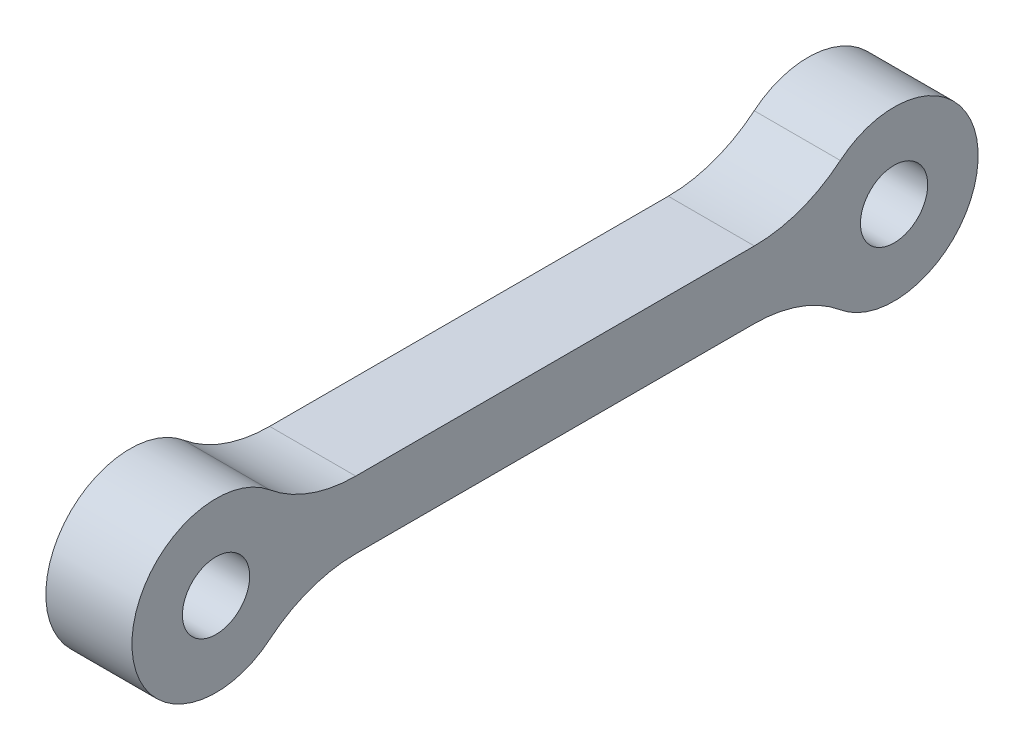
ISO-10303-21;
HEADER;
FILE_DESCRIPTION(('STEP AP214'),'2;1');
FILE_NAME('part.step','',(''),(''),'','','');
FILE_SCHEMA(('AUTOMOTIVE_DESIGN { 1 0 10303 214 1 1 1 1 }'));
ENDSEC;
DATA;
#1=APPLICATION_CONTEXT('core data for automotive mechanical design processes');
#2=APPLICATION_PROTOCOL_DEFINITION('international standard','automotive_design',2000,#1);
#3=PRODUCT_CONTEXT('',#1,'mechanical');
#4=PRODUCT('Part','Part','',(#3));
#5=PRODUCT_RELATED_PRODUCT_CATEGORY('part','',(#4));
#6=PRODUCT_DEFINITION_FORMATION('','',#4);
#7=PRODUCT_DEFINITION_CONTEXT('part definition',#1,'design');
#8=PRODUCT_DEFINITION('design','',#6,#7);
#9=PRODUCT_DEFINITION_SHAPE('','',#8);
#10=(LENGTH_UNIT() NAMED_UNIT(*) SI_UNIT(.MILLI.,.METRE.));
#11=(NAMED_UNIT(*) PLANE_ANGLE_UNIT() SI_UNIT($,.RADIAN.));
#12=(NAMED_UNIT(*) SI_UNIT($,.STERADIAN.) SOLID_ANGLE_UNIT());
#13=UNCERTAINTY_MEASURE_WITH_UNIT(LENGTH_MEASURE(1.E-05),#10,'distance_accuracy_value','');
#14=(GEOMETRIC_REPRESENTATION_CONTEXT(3) GLOBAL_UNCERTAINTY_ASSIGNED_CONTEXT((#13)) GLOBAL_UNIT_ASSIGNED_CONTEXT((#10,
#11,#12)) REPRESENTATION_CONTEXT('',''));
#15=CARTESIAN_POINT('',(0.,0.,0.));
#16=DIRECTION('',(0.,0.,1.));
#17=DIRECTION('',(1.,0.,0.));
#18=AXIS2_PLACEMENT_3D('',#15,#16,#17);
#19=CARTESIAN_POINT('',(4.064,0.,0.));
#20=DIRECTION('',(1.,0.,0.));
#21=DIRECTION('',(0.,0.,-1.));
#22=AXIS2_PLACEMENT_3D('',#19,#20,#21);
#23=PLANE('',#22);
#24=CARTESIAN_POINT('',(4.064,0.,0.));
#25=DIRECTION('',(1.,0.,0.));
#26=DIRECTION('',(0.,0.,-1.));
#27=AXIS2_PLACEMENT_3D('',#24,#25,#26);
#28=CIRCLE('',#27,1.5875);
#29=CARTESIAN_POINT('',(4.064,0.,-1.5875));
#30=VERTEX_POINT('',#29);
#31=EDGE_CURVE('E197',#30,#30,#28,.T.);
#32=ORIENTED_EDGE('',*,*,#31,.F.);
#33=EDGE_LOOP('',(#32));
#34=FACE_BOUND('',#33,.T.);
#35=DIRECTION('',(0.,0.,1.));
#36=VECTOR('',#35,1.);
#37=CARTESIAN_POINT('',(4.064,1.5875,-3.6374194578712));
#38=LINE('',#37,#36);
#39=CARTESIAN_POINT('',(4.064,1.5875,-25.4066173088088));
#40=VERTEX_POINT('',#39);
#41=CARTESIAN_POINT('',(4.064,1.5875,-6.59338269119122));
#42=VERTEX_POINT('',#41);
#43=EDGE_CURVE('E128',#40,#42,#38,.T.);
#44=ORIENTED_EDGE('',*,*,#43,.T.);
#45=CARTESIAN_POINT('',(4.064,7.9375,-6.59338269119122));
#46=DIRECTION('',(1.,0.,0.));
#47=DIRECTION('',(0.,0.,-1.));
#48=AXIS2_PLACEMENT_3D('',#45,#46,#47);
#49=CIRCLE('',#48,6.35);
#50=CARTESIAN_POINT('',(4.064,3.05288461538462,-2.53591641968893));
#51=VERTEX_POINT('',#50);
#52=EDGE_CURVE('E11',#42,#51,#49,.F.);
#53=ORIENTED_EDGE('',*,*,#52,.T.);
#54=CARTESIAN_POINT('',(4.064,0.,0.));
#55=DIRECTION('',(1.,0.,0.));
#56=DIRECTION('',(0.,0.,-1.));
#57=AXIS2_PLACEMENT_3D('',#54,#55,#56);
#58=CIRCLE('',#57,3.96875);
#59=CARTESIAN_POINT('',(4.064,-3.05288461538461,-2.53591641968893));
#60=VERTEX_POINT('',#59);
#61=EDGE_CURVE('E137',#51,#60,#58,.T.);
#62=ORIENTED_EDGE('',*,*,#61,.T.);
#63=CARTESIAN_POINT('',(4.064,-7.9375,-6.59338269119122));
#64=DIRECTION('',(1.,0.,0.));
#65=DIRECTION('',(0.,0.,-1.));
#66=AXIS2_PLACEMENT_3D('',#63,#64,#65);
#67=CIRCLE('',#66,6.35);
#68=CARTESIAN_POINT('',(4.064,-1.5875,-6.59338269119122));
#69=VERTEX_POINT('',#68);
#70=EDGE_CURVE('E179',#60,#69,#67,.F.);
#71=ORIENTED_EDGE('',*,*,#70,.T.);
#72=DIRECTION('',(0.,0.,-1.));
#73=VECTOR('',#72,1.);
#74=CARTESIAN_POINT('',(4.064,-1.5875,-3.6374194578712));
#75=LINE('',#74,#73);
#76=CARTESIAN_POINT('',(4.064,-1.5875,-25.4066173088088));
#77=VERTEX_POINT('',#76);
#78=EDGE_CURVE('E142',#69,#77,#75,.T.);
#79=ORIENTED_EDGE('',*,*,#78,.T.);
#80=CARTESIAN_POINT('',(4.064,-7.9375,-25.4066173088088));
#81=DIRECTION('',(1.,0.,0.));
#82=DIRECTION('',(0.,0.,-1.));
#83=AXIS2_PLACEMENT_3D('',#80,#81,#82);
#84=CIRCLE('',#83,6.35);
#85=CARTESIAN_POINT('',(4.064,-3.05288461538461,-29.4640835803111));
#86=VERTEX_POINT('',#85);
#87=EDGE_CURVE('E173',#77,#86,#84,.F.);
#88=ORIENTED_EDGE('',*,*,#87,.T.);
#89=CARTESIAN_POINT('',(4.064,0.,-32.));
#90=DIRECTION('',(1.,0.,0.));
#91=DIRECTION('',(0.,0.,-1.));
#92=AXIS2_PLACEMENT_3D('',#89,#90,#91);
#93=CIRCLE('',#92,3.96875);
#94=CARTESIAN_POINT('',(4.064,3.05288461538462,-29.4640835803111));
#95=VERTEX_POINT('',#94);
#96=EDGE_CURVE('E184',#86,#95,#93,.T.);
#97=ORIENTED_EDGE('',*,*,#96,.T.);
#98=CARTESIAN_POINT('',(4.064,7.9375,-25.4066173088088));
#99=DIRECTION('',(1.,0.,0.));
#100=DIRECTION('',(0.,0.,-1.));
#101=AXIS2_PLACEMENT_3D('',#98,#99,#100);
#102=CIRCLE('',#101,6.35);
#103=EDGE_CURVE('E120',#95,#40,#102,.F.);
#104=ORIENTED_EDGE('',*,*,#103,.T.);
#105=EDGE_LOOP('',(#44,#53,#62,#71,#79,#88,#97,#104));
#106=FACE_BOUND('',#105,.T.);
#107=CARTESIAN_POINT('',(4.064,0.,-32.));
#108=DIRECTION('',(1.,0.,0.));
#109=DIRECTION('',(0.,0.,-1.));
#110=AXIS2_PLACEMENT_3D('',#107,#108,#109);
#111=CIRCLE('',#110,1.5875);
#112=CARTESIAN_POINT('',(4.064,0.,-33.5875));
#113=VERTEX_POINT('',#112);
#114=EDGE_CURVE('E244',#113,#113,#111,.T.);
#115=ORIENTED_EDGE('',*,*,#114,.F.);
#116=EDGE_LOOP('',(#115));
#117=FACE_BOUND('',#116,.T.);
#118=ADVANCED_FACE('F43',(#34,#106,#117),#23,.T.);
#119=CARTESIAN_POINT('',(0.,0.,0.));
#120=DIRECTION('',(1.,0.,0.));
#121=DIRECTION('',(0.,0.,-1.));
#122=AXIS2_PLACEMENT_3D('',#119,#120,#121);
#123=PLANE('',#122);
#124=CARTESIAN_POINT('',(0.,0.,0.));
#125=DIRECTION('',(1.,0.,0.));
#126=DIRECTION('',(0.,0.,-1.));
#127=AXIS2_PLACEMENT_3D('',#124,#125,#126);
#128=CIRCLE('',#127,3.96875);
#129=CARTESIAN_POINT('',(0.,3.05288461538462,-2.53591641968893));
#130=VERTEX_POINT('',#129);
#131=CARTESIAN_POINT('',(0.,-3.05288461538461,-2.53591641968893));
#132=VERTEX_POINT('',#131);
#133=EDGE_CURVE('E195',#130,#132,#128,.T.);
#134=ORIENTED_EDGE('',*,*,#133,.F.);
#135=CARTESIAN_POINT('',(0.,7.9375,-6.59338269119122));
#136=DIRECTION('',(1.,0.,0.));
#137=DIRECTION('',(0.,0.,-1.));
#138=AXIS2_PLACEMENT_3D('',#135,#136,#137);
#139=CIRCLE('',#138,6.35);
#140=CARTESIAN_POINT('',(0.,1.5875,-6.59338269119122));
#141=VERTEX_POINT('',#140);
#142=EDGE_CURVE('E52',#130,#141,#139,.T.);
#143=ORIENTED_EDGE('',*,*,#142,.T.);
#144=DIRECTION('',(0.,0.,1.));
#145=VECTOR('',#144,1.);
#146=CARTESIAN_POINT('',(0.,1.5875,-3.6374194578712));
#147=LINE('',#146,#145);
#148=CARTESIAN_POINT('',(0.,1.5875,-25.4066173088088));
#149=VERTEX_POINT('',#148);
#150=EDGE_CURVE('E126',#149,#141,#147,.T.);
#151=ORIENTED_EDGE('',*,*,#150,.F.);
#152=CARTESIAN_POINT('',(0.,7.9375,-25.4066173088088));
#153=DIRECTION('',(1.,0.,0.));
#154=DIRECTION('',(0.,0.,-1.));
#155=AXIS2_PLACEMENT_3D('',#152,#153,#154);
#156=CIRCLE('',#155,6.35);
#157=CARTESIAN_POINT('',(0.,3.05288461538462,-29.4640835803111));
#158=VERTEX_POINT('',#157);
#159=EDGE_CURVE('E109',#149,#158,#156,.T.);
#160=ORIENTED_EDGE('',*,*,#159,.T.);
#161=CARTESIAN_POINT('',(0.,0.,-32.));
#162=DIRECTION('',(1.,0.,0.));
#163=DIRECTION('',(0.,0.,-1.));
#164=AXIS2_PLACEMENT_3D('',#161,#162,#163);
#165=CIRCLE('',#164,3.96875);
#166=CARTESIAN_POINT('',(0.,-3.05288461538461,-29.4640835803111));
#167=VERTEX_POINT('',#166);
#168=EDGE_CURVE('E138',#167,#158,#165,.T.);
#169=ORIENTED_EDGE('',*,*,#168,.F.);
#170=CARTESIAN_POINT('',(0.,-7.9375,-25.4066173088088));
#171=DIRECTION('',(1.,0.,0.));
#172=DIRECTION('',(0.,0.,-1.));
#173=AXIS2_PLACEMENT_3D('',#170,#171,#172);
#174=CIRCLE('',#173,6.35);
#175=CARTESIAN_POINT('',(0.,-1.5875,-25.4066173088088));
#176=VERTEX_POINT('',#175);
#177=EDGE_CURVE('E170',#167,#176,#174,.T.);
#178=ORIENTED_EDGE('',*,*,#177,.T.);
#179=DIRECTION('',(0.,0.,-1.));
#180=VECTOR('',#179,1.);
#181=CARTESIAN_POINT('',(0.,-1.5875,-3.6374194578712));
#182=LINE('',#181,#180);
#183=CARTESIAN_POINT('',(0.,-1.5875,-6.59338269119122));
#184=VERTEX_POINT('',#183);
#185=EDGE_CURVE('E144',#184,#176,#182,.T.);
#186=ORIENTED_EDGE('',*,*,#185,.F.);
#187=CARTESIAN_POINT('',(0.,-7.9375,-6.59338269119122));
#188=DIRECTION('',(1.,0.,0.));
#189=DIRECTION('',(0.,0.,-1.));
#190=AXIS2_PLACEMENT_3D('',#187,#188,#189);
#191=CIRCLE('',#190,6.35);
#192=EDGE_CURVE('E176',#184,#132,#191,.T.);
#193=ORIENTED_EDGE('',*,*,#192,.T.);
#194=EDGE_LOOP('',(#134,#143,#151,#160,#169,#178,#186,#193));
#195=FACE_BOUND('',#194,.T.);
#196=CARTESIAN_POINT('',(0.,0.,0.));
#197=DIRECTION('',(1.,0.,0.));
#198=DIRECTION('',(0.,0.,-1.));
#199=AXIS2_PLACEMENT_3D('',#196,#197,#198);
#200=CIRCLE('',#199,1.5875);
#201=CARTESIAN_POINT('',(0.,0.,-1.5875));
#202=VERTEX_POINT('',#201);
#203=EDGE_CURVE('E252',#202,#202,#200,.T.);
#204=ORIENTED_EDGE('',*,*,#203,.T.);
#205=EDGE_LOOP('',(#204));
#206=FACE_BOUND('',#205,.T.);
#207=CARTESIAN_POINT('',(0.,0.,-32.));
#208=DIRECTION('',(1.,0.,0.));
#209=DIRECTION('',(0.,0.,-1.));
#210=AXIS2_PLACEMENT_3D('',#207,#208,#209);
#211=CIRCLE('',#210,1.5875);
#212=CARTESIAN_POINT('',(0.,0.,-33.5875));
#213=VERTEX_POINT('',#212);
#214=EDGE_CURVE('E247',#213,#213,#211,.T.);
#215=ORIENTED_EDGE('',*,*,#214,.T.);
#216=EDGE_LOOP('',(#215));
#217=FACE_BOUND('',#216,.T.);
#218=ADVANCED_FACE('F134',(#195,#206,#217),#123,.F.);
#219=CARTESIAN_POINT('',(4.064,0.,0.));
#220=DIRECTION('',(-1.,0.,0.));
#221=DIRECTION('',(0.,0.,1.));
#222=AXIS2_PLACEMENT_3D('',#219,#220,#221);
#223=CYLINDRICAL_SURFACE('',#222,3.96875);
#224=ORIENTED_EDGE('',*,*,#133,.T.);
#225=DIRECTION('',(-1.,0.,0.));
#226=VECTOR('',#225,1.);
#227=CARTESIAN_POINT('',(4.064,-3.05288461538462,-2.53591641968893));
#228=LINE('',#227,#226);
#229=EDGE_CURVE('E59',#132,#60,#228,.F.);
#230=ORIENTED_EDGE('',*,*,#229,.T.);
#231=ORIENTED_EDGE('',*,*,#61,.F.);
#232=DIRECTION('',(-1.,0.,0.));
#233=VECTOR('',#232,1.);
#234=CARTESIAN_POINT('',(4.064,3.05288461538462,-2.53591641968893));
#235=LINE('',#234,#233);
#236=EDGE_CURVE('E162',#51,#130,#235,.T.);
#237=ORIENTED_EDGE('',*,*,#236,.T.);
#238=EDGE_LOOP('',(#224,#230,#231,#237));
#239=FACE_BOUND('',#238,.T.);
#240=ADVANCED_FACE('F220',(#239),#223,.T.);
#241=CARTESIAN_POINT('',(4.064,-1.5875,-3.6374194578712));
#242=DIRECTION('',(0.,1.,0.));
#243=DIRECTION('',(0.,0.,1.));
#244=AXIS2_PLACEMENT_3D('',#241,#242,#243);
#245=PLANE('',#244);
#246=ORIENTED_EDGE('',*,*,#185,.T.);
#247=DIRECTION('',(1.,0.,0.));
#248=VECTOR('',#247,1.);
#249=CARTESIAN_POINT('',(4.064,-1.5875,-25.4066173088088));
#250=LINE('',#249,#248);
#251=EDGE_CURVE('E159',#176,#77,#250,.T.);
#252=ORIENTED_EDGE('',*,*,#251,.T.);
#253=ORIENTED_EDGE('',*,*,#78,.F.);
#254=DIRECTION('',(1.,0.,0.));
#255=VECTOR('',#254,1.);
#256=CARTESIAN_POINT('',(0.,-1.5875,-6.59338269119122));
#257=LINE('',#256,#255);
#258=EDGE_CURVE('E155',#69,#184,#257,.F.);
#259=ORIENTED_EDGE('',*,*,#258,.T.);
#260=EDGE_LOOP('',(#246,#252,#253,#259));
#261=FACE_BOUND('',#260,.T.);
#262=ADVANCED_FACE('F203',(#261),#245,.F.);
#263=CARTESIAN_POINT('',(4.064,0.,-32.));
#264=DIRECTION('',(-1.,0.,0.));
#265=DIRECTION('',(0.,0.,1.));
#266=AXIS2_PLACEMENT_3D('',#263,#264,#265);
#267=CYLINDRICAL_SURFACE('',#266,3.96875);
#268=ORIENTED_EDGE('',*,*,#168,.T.);
#269=DIRECTION('',(-1.,0.,0.));
#270=VECTOR('',#269,1.);
#271=CARTESIAN_POINT('',(4.064,3.05288461538462,-29.4640835803111));
#272=LINE('',#271,#270);
#273=EDGE_CURVE('E114',#158,#95,#272,.F.);
#274=ORIENTED_EDGE('',*,*,#273,.T.);
#275=ORIENTED_EDGE('',*,*,#96,.F.);
#276=DIRECTION('',(-1.,0.,0.));
#277=VECTOR('',#276,1.);
#278=CARTESIAN_POINT('',(4.064,-3.05288461538461,-29.4640835803111));
#279=LINE('',#278,#277);
#280=EDGE_CURVE('E130',#86,#167,#279,.T.);
#281=ORIENTED_EDGE('',*,*,#280,.T.);
#282=EDGE_LOOP('',(#268,#274,#275,#281));
#283=FACE_BOUND('',#282,.T.);
#284=ADVANCED_FACE('F211',(#283),#267,.T.);
#285=CARTESIAN_POINT('',(4.064,1.5875,-3.6374194578712));
#286=DIRECTION('',(0.,-1.,0.));
#287=DIRECTION('',(0.,0.,-1.));
#288=AXIS2_PLACEMENT_3D('',#285,#286,#287);
#289=PLANE('',#288);
#290=ORIENTED_EDGE('',*,*,#43,.F.);
#291=DIRECTION('',(1.,0.,0.));
#292=VECTOR('',#291,1.);
#293=CARTESIAN_POINT('',(0.,1.5875,-25.4066173088088));
#294=LINE('',#293,#292);
#295=EDGE_CURVE('E113',#40,#149,#294,.F.);
#296=ORIENTED_EDGE('',*,*,#295,.T.);
#297=ORIENTED_EDGE('',*,*,#150,.T.);
#298=DIRECTION('',(1.,0.,0.));
#299=VECTOR('',#298,1.);
#300=CARTESIAN_POINT('',(4.064,1.5875,-6.59338269119122));
#301=LINE('',#300,#299);
#302=EDGE_CURVE('E131',#141,#42,#301,.T.);
#303=ORIENTED_EDGE('',*,*,#302,.T.);
#304=EDGE_LOOP('',(#290,#296,#297,#303));
#305=FACE_BOUND('',#304,.T.);
#306=ADVANCED_FACE('F125',(#305),#289,.F.);
#307=CARTESIAN_POINT('',(4.064,0.,0.));
#308=DIRECTION('',(-1.,0.,0.));
#309=DIRECTION('',(0.,0.,1.));
#310=AXIS2_PLACEMENT_3D('',#307,#308,#309);
#311=CYLINDRICAL_SURFACE('',#310,1.5875);
#312=ORIENTED_EDGE('',*,*,#31,.T.);
#313=EDGE_LOOP('',(#312));
#314=FACE_BOUND('',#313,.T.);
#315=ORIENTED_EDGE('',*,*,#203,.F.);
#316=EDGE_LOOP('',(#315));
#317=FACE_BOUND('',#316,.T.);
#318=ADVANCED_FACE('F218',(#314,#317),#311,.F.);
#319=CARTESIAN_POINT('',(4.064,0.,-32.));
#320=DIRECTION('',(-1.,0.,0.));
#321=DIRECTION('',(0.,0.,1.));
#322=AXIS2_PLACEMENT_3D('',#319,#320,#321);
#323=CYLINDRICAL_SURFACE('',#322,1.5875);
#324=ORIENTED_EDGE('',*,*,#114,.T.);
#325=EDGE_LOOP('',(#324));
#326=FACE_BOUND('',#325,.T.);
#327=ORIENTED_EDGE('',*,*,#214,.F.);
#328=EDGE_LOOP('',(#327));
#329=FACE_BOUND('',#328,.T.);
#330=ADVANCED_FACE('F233',(#326,#329),#323,.F.);
#331=CARTESIAN_POINT('',(4.064,7.9375,-25.4066173088088));
#332=DIRECTION('',(-1.,0.,0.));
#333=DIRECTION('',(0.,0.,1.));
#334=AXIS2_PLACEMENT_3D('',#331,#332,#333);
#335=CYLINDRICAL_SURFACE('',#334,6.35);
#336=ORIENTED_EDGE('',*,*,#103,.F.);
#337=ORIENTED_EDGE('',*,*,#273,.F.);
#338=ORIENTED_EDGE('',*,*,#159,.F.);
#339=ORIENTED_EDGE('',*,*,#295,.F.);
#340=EDGE_LOOP('',(#336,#337,#338,#339));
#341=FACE_BOUND('',#340,.T.);
#342=ADVANCED_FACE('F112',(#341),#335,.F.);
#343=CARTESIAN_POINT('',(4.064,-7.9375,-25.4066173088088));
#344=DIRECTION('',(-1.,0.,0.));
#345=DIRECTION('',(0.,0.,1.));
#346=AXIS2_PLACEMENT_3D('',#343,#344,#345);
#347=CYLINDRICAL_SURFACE('',#346,6.35);
#348=ORIENTED_EDGE('',*,*,#87,.F.);
#349=ORIENTED_EDGE('',*,*,#251,.F.);
#350=ORIENTED_EDGE('',*,*,#177,.F.);
#351=ORIENTED_EDGE('',*,*,#280,.F.);
#352=EDGE_LOOP('',(#348,#349,#350,#351));
#353=FACE_BOUND('',#352,.T.);
#354=ADVANCED_FACE('F206',(#353),#347,.F.);
#355=CARTESIAN_POINT('',(4.064,-7.9375,-6.59338269119122));
#356=DIRECTION('',(-1.,0.,0.));
#357=DIRECTION('',(0.,0.,1.));
#358=AXIS2_PLACEMENT_3D('',#355,#356,#357);
#359=CYLINDRICAL_SURFACE('',#358,6.35);
#360=ORIENTED_EDGE('',*,*,#70,.F.);
#361=ORIENTED_EDGE('',*,*,#229,.F.);
#362=ORIENTED_EDGE('',*,*,#192,.F.);
#363=ORIENTED_EDGE('',*,*,#258,.F.);
#364=EDGE_LOOP('',(#360,#361,#362,#363));
#365=FACE_BOUND('',#364,.T.);
#366=ADVANCED_FACE('F264',(#365),#359,.F.);
#367=CARTESIAN_POINT('',(4.064,7.9375,-6.59338269119122));
#368=DIRECTION('',(-1.,0.,0.));
#369=DIRECTION('',(0.,0.,1.));
#370=AXIS2_PLACEMENT_3D('',#367,#368,#369);
#371=CYLINDRICAL_SURFACE('',#370,6.35);
#372=ORIENTED_EDGE('',*,*,#52,.F.);
#373=ORIENTED_EDGE('',*,*,#302,.F.);
#374=ORIENTED_EDGE('',*,*,#142,.F.);
#375=ORIENTED_EDGE('',*,*,#236,.F.);
#376=EDGE_LOOP('',(#372,#373,#374,#375));
#377=FACE_BOUND('',#376,.T.);
#378=ADVANCED_FACE('F45',(#377),#371,.F.);
#379=CLOSED_SHELL('',(#118,#218,#240,#262,#284,#306,#318,#330,#342,#354,#366,#378));
#380=MANIFOLD_SOLID_BREP('B2',#379);
#381=ADVANCED_BREP_SHAPE_REPRESENTATION('',(#18,#380),#14);
#382=SHAPE_DEFINITION_REPRESENTATION(#9,#381);
ENDSEC;
END-ISO-10303-21;
